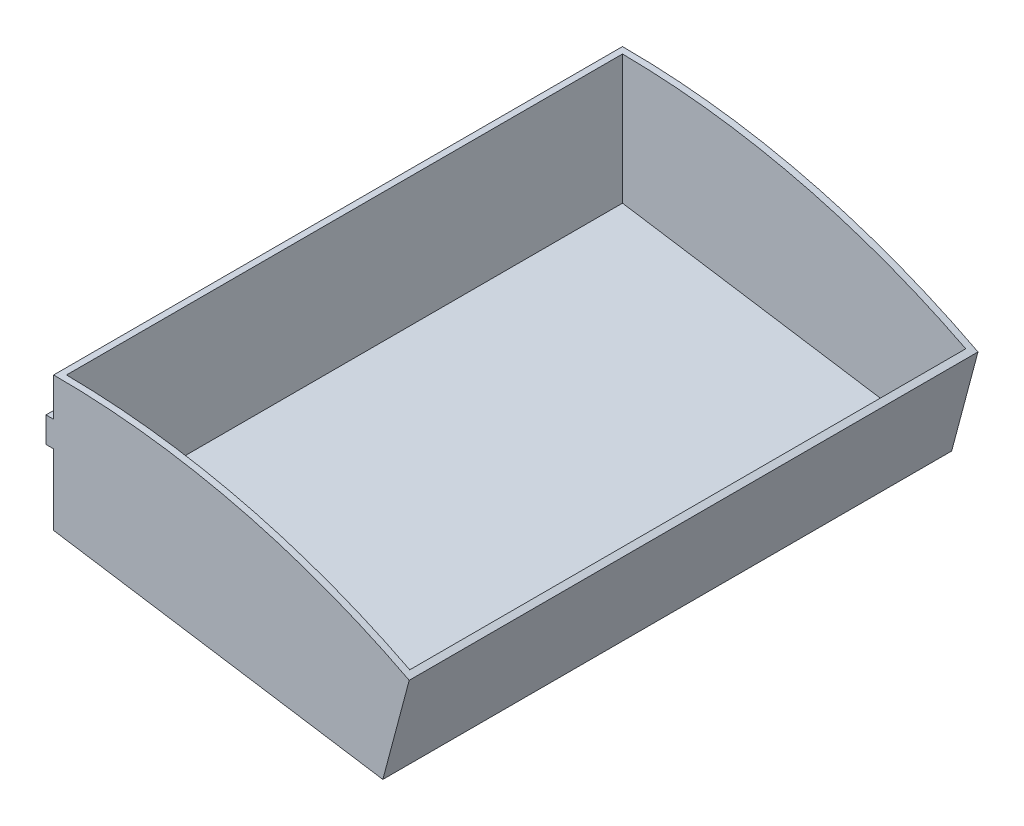
ISO-10303-21;
HEADER;
FILE_DESCRIPTION(('STEP AP214'),'2;1');
FILE_NAME('part.step','',(''),(''),'','','');
FILE_SCHEMA(('AUTOMOTIVE_DESIGN { 1 0 10303 214 1 1 1 1 }'));
ENDSEC;
DATA;
#1=APPLICATION_CONTEXT('core data for automotive mechanical design processes');
#2=APPLICATION_PROTOCOL_DEFINITION('international standard','automotive_design',2000,#1);
#3=PRODUCT_CONTEXT('',#1,'mechanical');
#4=PRODUCT('Part','Part','',(#3));
#5=PRODUCT_RELATED_PRODUCT_CATEGORY('part','',(#4));
#6=PRODUCT_DEFINITION_FORMATION('','',#4);
#7=PRODUCT_DEFINITION_CONTEXT('part definition',#1,'design');
#8=PRODUCT_DEFINITION('design','',#6,#7);
#9=PRODUCT_DEFINITION_SHAPE('','',#8);
#10=(LENGTH_UNIT() NAMED_UNIT(*) SI_UNIT(.MILLI.,.METRE.));
#11=(NAMED_UNIT(*) PLANE_ANGLE_UNIT() SI_UNIT($,.RADIAN.));
#12=(NAMED_UNIT(*) SI_UNIT($,.STERADIAN.) SOLID_ANGLE_UNIT());
#13=UNCERTAINTY_MEASURE_WITH_UNIT(LENGTH_MEASURE(1.E-05),#10,'distance_accuracy_value','');
#14=(GEOMETRIC_REPRESENTATION_CONTEXT(3) GLOBAL_UNCERTAINTY_ASSIGNED_CONTEXT((#13)) GLOBAL_UNIT_ASSIGNED_CONTEXT((#10,
#11,#12)) REPRESENTATION_CONTEXT('',''));
#15=CARTESIAN_POINT('',(0.,0.,0.));
#16=DIRECTION('',(0.,0.,1.));
#17=DIRECTION('',(1.,0.,0.));
#18=AXIS2_PLACEMENT_3D('',#15,#16,#17);
#19=CARTESIAN_POINT('',(0.,0.,563.88));
#20=DIRECTION('',(1.,0.,0.));
#21=DIRECTION('',(0.,0.,-1.));
#22=AXIS2_PLACEMENT_3D('',#19,#20,#21);
#23=PLANE('',#22);
#24=DIRECTION('',(0.,0.,-1.));
#25=VECTOR('',#24,1.);
#26=CARTESIAN_POINT('',(0.,95.472018750518,0.));
#27=LINE('',#26,#25);
#28=CARTESIAN_POINT('',(0.,95.472018750518,563.88));
#29=VERTEX_POINT('',#28);
#30=CARTESIAN_POINT('',(0.,95.472018750518,0.));
#31=VERTEX_POINT('',#30);
#32=EDGE_CURVE('E49',#29,#31,#27,.T.);
#33=ORIENTED_EDGE('',*,*,#32,.F.);
#34=DIRECTION('',(0.,-1.,0.));
#35=VECTOR('',#34,1.);
#36=CARTESIAN_POINT('',(0.,0.,563.88));
#37=LINE('',#36,#35);
#38=CARTESIAN_POINT('',(0.,133.572018750518,563.88));
#39=VERTEX_POINT('',#38);
#40=EDGE_CURVE('E194',#39,#29,#37,.T.);
#41=ORIENTED_EDGE('',*,*,#40,.F.);
#42=DIRECTION('',(0.,0.,-1.));
#43=VECTOR('',#42,1.);
#44=CARTESIAN_POINT('',(0.,133.572018750518,563.88));
#45=LINE('',#44,#43);
#46=CARTESIAN_POINT('',(0.,133.572018750518,0.));
#47=VERTEX_POINT('',#46);
#48=EDGE_CURVE('E206',#39,#47,#45,.T.);
#49=ORIENTED_EDGE('',*,*,#48,.T.);
#50=DIRECTION('',(0.,-1.,0.));
#51=VECTOR('',#50,1.);
#52=CARTESIAN_POINT('',(0.,0.,0.));
#53=LINE('',#52,#51);
#54=EDGE_CURVE('E189',#47,#31,#53,.T.);
#55=ORIENTED_EDGE('',*,*,#54,.T.);
#56=EDGE_LOOP('',(#33,#41,#49,#55));
#57=FACE_BOUND('',#56,.T.);
#58=ADVANCED_FACE('F34',(#57),#23,.F.);
#59=DIRECTION('',(0.,0.,1.));
#60=VECTOR('',#59,1.);
#61=CARTESIAN_POINT('',(0.,70.072018750518,0.));
#62=LINE('',#61,#60);
#63=CARTESIAN_POINT('',(0.,70.072018750518,0.));
#64=VERTEX_POINT('',#63);
#65=CARTESIAN_POINT('',(0.,70.072018750518,563.88));
#66=VERTEX_POINT('',#65);
#67=EDGE_CURVE('E57',#64,#66,#62,.T.);
#68=ORIENTED_EDGE('',*,*,#67,.F.);
#69=CARTESIAN_POINT('',(0.,0.,0.));
#70=VERTEX_POINT('',#69);
#71=EDGE_CURVE('E146',#64,#70,#53,.T.);
#72=ORIENTED_EDGE('',*,*,#71,.T.);
#73=DIRECTION('',(0.,0.,-1.));
#74=VECTOR('',#73,1.);
#75=CARTESIAN_POINT('',(0.,0.,563.88));
#76=LINE('',#75,#74);
#77=CARTESIAN_POINT('',(0.,0.,563.88));
#78=VERTEX_POINT('',#77);
#79=EDGE_CURVE('E196',#78,#70,#76,.T.);
#80=ORIENTED_EDGE('',*,*,#79,.F.);
#81=EDGE_CURVE('E193',#66,#78,#37,.T.);
#82=ORIENTED_EDGE('',*,*,#81,.F.);
#83=EDGE_LOOP('',(#68,#72,#80,#82));
#84=FACE_BOUND('',#83,.T.);
#85=ADVANCED_FACE('F235',(#84),#23,.F.);
#86=CARTESIAN_POINT('',(0.,-631.814252311311,563.88));
#87=DIRECTION('',(0.,0.,-1.));
#88=DIRECTION('',(-1.,0.,0.));
#89=AXIS2_PLACEMENT_3D('',#86,#87,#88);
#90=CYLINDRICAL_SURFACE('',#89,765.386271061829);
#91=CARTESIAN_POINT('',(0.,-631.814252311311,0.));
#92=DIRECTION('',(0.,0.,1.));
#93=DIRECTION('',(-1.,0.,0.));
#94=AXIS2_PLACEMENT_3D('',#91,#92,#93);
#95=CIRCLE('',#94,765.386271061829);
#96=CARTESIAN_POINT('',(352.425,47.606650594194,0.));
#97=VERTEX_POINT('',#96);
#98=EDGE_CURVE('E201',#97,#47,#95,.T.);
#99=ORIENTED_EDGE('',*,*,#98,.T.);
#100=ORIENTED_EDGE('',*,*,#48,.F.);
#101=CARTESIAN_POINT('',(0.,-631.814252311311,563.88));
#102=DIRECTION('',(0.,0.,1.));
#103=DIRECTION('',(-1.,0.,0.));
#104=AXIS2_PLACEMENT_3D('',#101,#102,#103);
#105=CIRCLE('',#104,765.386271061829);
#106=CARTESIAN_POINT('',(352.425,47.606650594194,563.88));
#107=VERTEX_POINT('',#106);
#108=EDGE_CURVE('E191',#107,#39,#105,.T.);
#109=ORIENTED_EDGE('',*,*,#108,.F.);
#110=DIRECTION('',(0.,0.,-1.));
#111=VECTOR('',#110,1.);
#112=CARTESIAN_POINT('',(352.425,47.606650594194,563.88));
#113=LINE('',#112,#111);
#114=EDGE_CURVE('E42',#107,#97,#113,.T.);
#115=ORIENTED_EDGE('',*,*,#114,.T.);
#116=EDGE_LOOP('',(#99,#100,#109,#115));
#117=FACE_BOUND('',#116,.T.);
#118=CARTESIAN_POINT('',(0.,-631.814252311311,6.34999999999997));
#119=DIRECTION('',(0.,0.,-1.));
#120=DIRECTION('',(-1.,0.,0.));
#121=AXIS2_PLACEMENT_3D('',#118,#119,#120);
#122=CIRCLE('',#121,765.386271061829);
#123=CARTESIAN_POINT('',(346.64367750762,50.5744234255633,6.35));
#124=VERTEX_POINT('',#123);
#125=CARTESIAN_POINT('',(6.35,133.545677022549,6.35));
#126=VERTEX_POINT('',#125);
#127=EDGE_CURVE('E172',#124,#126,#122,.F.);
#128=ORIENTED_EDGE('',*,*,#127,.F.);
#129=DIRECTION('',(0.,0.,-1.));
#130=VECTOR('',#129,1.);
#131=CARTESIAN_POINT('',(346.64367750762,50.5744234255633,557.53));
#132=LINE('',#131,#130);
#133=CARTESIAN_POINT('',(346.64367750762,50.5744234255633,557.53));
#134=VERTEX_POINT('',#133);
#135=EDGE_CURVE('E160',#134,#124,#132,.T.);
#136=ORIENTED_EDGE('',*,*,#135,.F.);
#137=CARTESIAN_POINT('',(0.,-631.814252311311,557.53));
#138=DIRECTION('',(0.,0.,-1.));
#139=DIRECTION('',(-1.,0.,0.));
#140=AXIS2_PLACEMENT_3D('',#137,#138,#139);
#141=CIRCLE('',#140,765.386271061829);
#142=CARTESIAN_POINT('',(6.35,133.545677022549,557.53));
#143=VERTEX_POINT('',#142);
#144=EDGE_CURVE('E175',#134,#143,#141,.F.);
#145=ORIENTED_EDGE('',*,*,#144,.T.);
#146=DIRECTION('',(0.,0.,-1.));
#147=VECTOR('',#146,1.);
#148=CARTESIAN_POINT('',(6.35,133.545677022549,557.53));
#149=LINE('',#148,#147);
#150=EDGE_CURVE('E169',#143,#126,#149,.T.);
#151=ORIENTED_EDGE('',*,*,#150,.T.);
#152=EDGE_LOOP('',(#128,#136,#145,#151));
#153=FACE_BOUND('',#152,.T.);
#154=ADVANCED_FACE('F213',(#117,#153),#90,.T.);
#155=CARTESIAN_POINT('',(326.303398408179,-50.577981249482,563.88));
#156=DIRECTION('',(0.15317377725464,0.988199268347,0.));
#157=DIRECTION('',(-0.988199268347,0.15317377725464,0.));
#158=AXIS2_PLACEMENT_3D('',#155,#156,#157);
#159=PLANE('',#158);
#160=DIRECTION('',(0.988199268347,-0.15317377725464,0.));
#161=VECTOR('',#160,1.);
#162=CARTESIAN_POINT('',(326.303398408179,-50.577981249482,0.));
#163=LINE('',#162,#161);
#164=CARTESIAN_POINT('',(326.303398408179,-50.577981249482,0.));
#165=VERTEX_POINT('',#164);
#166=EDGE_CURVE('E159',#70,#165,#163,.T.);
#167=ORIENTED_EDGE('',*,*,#166,.T.);
#168=DIRECTION('',(0.,0.,-1.));
#169=VECTOR('',#168,1.);
#170=CARTESIAN_POINT('',(326.303398408179,-50.577981249482,563.88));
#171=LINE('',#170,#169);
#172=CARTESIAN_POINT('',(326.303398408179,-50.577981249482,563.88));
#173=VERTEX_POINT('',#172);
#174=EDGE_CURVE('E11',#173,#165,#171,.T.);
#175=ORIENTED_EDGE('',*,*,#174,.F.);
#176=DIRECTION('',(0.988199268347,-0.15317377725464,0.));
#177=VECTOR('',#176,1.);
#178=CARTESIAN_POINT('',(326.303398408179,-50.577981249482,563.88));
#179=LINE('',#178,#177);
#180=EDGE_CURVE('E185',#78,#173,#179,.T.);
#181=ORIENTED_EDGE('',*,*,#180,.F.);
#182=ORIENTED_EDGE('',*,*,#79,.T.);
#183=EDGE_LOOP('',(#167,#175,#181,#182));
#184=FACE_BOUND('',#183,.T.);
#185=ADVANCED_FACE('F36',(#184),#159,.F.);
#186=CARTESIAN_POINT('',(352.425,47.6066505941939,563.88));
#187=DIRECTION('',(-0.966384171689724,0.257102377872251,0.));
#188=DIRECTION('',(-0.257102377872251,-0.966384171689724,0.));
#189=AXIS2_PLACEMENT_3D('',#186,#187,#188);
#190=PLANE('',#189);
#191=DIRECTION('',(0.257102377872251,0.966384171689724,0.));
#192=VECTOR('',#191,1.);
#193=CARTESIAN_POINT('',(352.425,47.6066505941939,0.));
#194=LINE('',#193,#192);
#195=EDGE_CURVE('E199',#165,#97,#194,.T.);
#196=ORIENTED_EDGE('',*,*,#195,.T.);
#197=ORIENTED_EDGE('',*,*,#114,.F.);
#198=DIRECTION('',(0.257102377872251,0.966384171689724,0.));
#199=VECTOR('',#198,1.);
#200=CARTESIAN_POINT('',(352.425,47.6066505941939,563.88));
#201=LINE('',#200,#199);
#202=EDGE_CURVE('E188',#173,#107,#201,.T.);
#203=ORIENTED_EDGE('',*,*,#202,.F.);
#204=ORIENTED_EDGE('',*,*,#174,.T.);
#205=EDGE_LOOP('',(#196,#197,#203,#204));
#206=FACE_BOUND('',#205,.T.);
#207=ADVANCED_FACE('F232',(#206),#190,.F.);
#208=CARTESIAN_POINT('',(0.,-631.814252311311,563.88));
#209=DIRECTION('',(0.,0.,-1.));
#210=DIRECTION('',(-1.,0.,0.));
#211=AXIS2_PLACEMENT_3D('',#208,#209,#210);
#212=PLANE('',#211);
#213=ORIENTED_EDGE('',*,*,#180,.T.);
#214=ORIENTED_EDGE('',*,*,#202,.T.);
#215=ORIENTED_EDGE('',*,*,#108,.T.);
#216=ORIENTED_EDGE('',*,*,#40,.T.);
#217=DIRECTION('',(1.,0.,0.));
#218=VECTOR('',#217,1.);
#219=CARTESIAN_POINT('',(-7.62,95.472018750518,563.88));
#220=LINE('',#219,#218);
#221=CARTESIAN_POINT('',(-7.62,95.472018750518,563.88));
#222=VERTEX_POINT('',#221);
#223=EDGE_CURVE('E152',#222,#29,#220,.T.);
#224=ORIENTED_EDGE('',*,*,#223,.F.);
#225=DIRECTION('',(0.,1.,0.));
#226=VECTOR('',#225,1.);
#227=CARTESIAN_POINT('',(-7.62,95.472018750518,563.88));
#228=LINE('',#227,#226);
#229=CARTESIAN_POINT('',(-7.62,70.072018750518,563.88));
#230=VERTEX_POINT('',#229);
#231=EDGE_CURVE('E133',#230,#222,#228,.T.);
#232=ORIENTED_EDGE('',*,*,#231,.F.);
#233=DIRECTION('',(1.,0.,0.));
#234=VECTOR('',#233,1.);
#235=CARTESIAN_POINT('',(-7.62,70.072018750518,563.88));
#236=LINE('',#235,#234);
#237=EDGE_CURVE('E130',#230,#66,#236,.T.);
#238=ORIENTED_EDGE('',*,*,#237,.T.);
#239=ORIENTED_EDGE('',*,*,#81,.T.);
#240=EDGE_LOOP('',(#213,#214,#215,#216,#224,#232,#238,#239));
#241=FACE_BOUND('',#240,.T.);
#242=ADVANCED_FACE('F229',(#241),#212,.F.);
#243=CARTESIAN_POINT('',(0.,-631.814252311311,0.));
#244=DIRECTION('',(0.,0.,-1.));
#245=DIRECTION('',(-1.,0.,0.));
#246=AXIS2_PLACEMENT_3D('',#243,#244,#245);
#247=PLANE('',#246);
#248=ORIENTED_EDGE('',*,*,#166,.F.);
#249=ORIENTED_EDGE('',*,*,#71,.F.);
#250=DIRECTION('',(1.,0.,0.));
#251=VECTOR('',#250,1.);
#252=CARTESIAN_POINT('',(-7.62,70.072018750518,0.));
#253=LINE('',#252,#251);
#254=CARTESIAN_POINT('',(-7.62,70.072018750518,0.));
#255=VERTEX_POINT('',#254);
#256=EDGE_CURVE('E128',#255,#64,#253,.T.);
#257=ORIENTED_EDGE('',*,*,#256,.F.);
#258=DIRECTION('',(0.,-1.,0.));
#259=VECTOR('',#258,1.);
#260=CARTESIAN_POINT('',(-7.62,95.472018750518,0.));
#261=LINE('',#260,#259);
#262=CARTESIAN_POINT('',(-7.62,95.472018750518,0.));
#263=VERTEX_POINT('',#262);
#264=EDGE_CURVE('E134',#263,#255,#261,.T.);
#265=ORIENTED_EDGE('',*,*,#264,.F.);
#266=DIRECTION('',(1.,0.,0.));
#267=VECTOR('',#266,1.);
#268=CARTESIAN_POINT('',(-7.62,95.472018750518,0.));
#269=LINE('',#268,#267);
#270=EDGE_CURVE('E218',#263,#31,#269,.T.);
#271=ORIENTED_EDGE('',*,*,#270,.T.);
#272=ORIENTED_EDGE('',*,*,#54,.F.);
#273=ORIENTED_EDGE('',*,*,#98,.F.);
#274=ORIENTED_EDGE('',*,*,#195,.F.);
#275=EDGE_LOOP('',(#248,#249,#257,#265,#271,#272,#273,#274));
#276=FACE_BOUND('',#275,.T.);
#277=ADVANCED_FACE('F145',(#276),#247,.T.);
#278=CARTESIAN_POINT('',(327.276051893746,-44.3029158954786,563.88));
#279=DIRECTION('',(0.15317377725464,0.988199268347,0.));
#280=DIRECTION('',(-0.988199268347,0.15317377725464,0.));
#281=AXIS2_PLACEMENT_3D('',#278,#279,#280);
#282=PLANE('',#281);
#283=DIRECTION('',(0.988199268347,-0.15317377725464,0.));
#284=VECTOR('',#283,1.);
#285=CARTESIAN_POINT('',(96.6079851964612,-8.54869081175624,6.35));
#286=LINE('',#285,#284);
#287=CARTESIAN_POINT('',(6.35,5.44156091455921,6.35));
#288=VERTEX_POINT('',#287);
#289=CARTESIAN_POINT('',(321.634608056786,-43.4284755985104,6.35));
#290=VERTEX_POINT('',#289);
#291=EDGE_CURVE('E147',#288,#290,#286,.T.);
#292=ORIENTED_EDGE('',*,*,#291,.F.);
#293=DIRECTION('',(0.,0.,-1.));
#294=VECTOR('',#293,1.);
#295=CARTESIAN_POINT('',(6.35000000000002,5.4415609145592,563.88));
#296=LINE('',#295,#294);
#297=CARTESIAN_POINT('',(6.35,5.44156091455921,557.53));
#298=VERTEX_POINT('',#297);
#299=EDGE_CURVE('E166',#298,#288,#296,.T.);
#300=ORIENTED_EDGE('',*,*,#299,.F.);
#301=DIRECTION('',(0.988199268347,-0.15317377725464,0.));
#302=VECTOR('',#301,1.);
#303=CARTESIAN_POINT('',(96.6079851964612,-8.54869081175624,557.53));
#304=LINE('',#303,#302);
#305=CARTESIAN_POINT('',(321.634608056786,-43.4284755985104,557.53));
#306=VERTEX_POINT('',#305);
#307=EDGE_CURVE('E161',#298,#306,#304,.T.);
#308=ORIENTED_EDGE('',*,*,#307,.T.);
#309=DIRECTION('',(0.,0.,-1.));
#310=VECTOR('',#309,1.);
#311=CARTESIAN_POINT('',(321.634608056786,-43.4284755985104,563.88));
#312=LINE('',#311,#310);
#313=EDGE_CURVE('E156',#306,#290,#312,.T.);
#314=ORIENTED_EDGE('',*,*,#313,.T.);
#315=EDGE_LOOP('',(#292,#300,#308,#314));
#316=FACE_BOUND('',#315,.T.);
#317=ADVANCED_FACE('F265',(#316),#282,.T.);
#318=CARTESIAN_POINT('',(346.28846050977,49.2392506936827,563.88));
#319=DIRECTION('',(-0.966384171689724,0.257102377872251,0.));
#320=DIRECTION('',(-0.257102377872251,-0.966384171689724,0.));
#321=AXIS2_PLACEMENT_3D('',#318,#319,#320);
#322=PLANE('',#321);
#323=DIRECTION('',(0.257102377872251,0.966384171689724,0.));
#324=VECTOR('',#323,1.);
#325=CARTESIAN_POINT('',(154.18390030884,-672.834219898019,6.35));
#326=LINE('',#325,#324);
#327=EDGE_CURVE('E150',#290,#124,#326,.T.);
#328=ORIENTED_EDGE('',*,*,#327,.F.);
#329=ORIENTED_EDGE('',*,*,#313,.F.);
#330=DIRECTION('',(0.257102377872251,0.966384171689724,0.));
#331=VECTOR('',#330,1.);
#332=CARTESIAN_POINT('',(154.18390030884,-672.834219898019,557.53));
#333=LINE('',#332,#331);
#334=EDGE_CURVE('E164',#306,#134,#333,.T.);
#335=ORIENTED_EDGE('',*,*,#334,.T.);
#336=ORIENTED_EDGE('',*,*,#135,.T.);
#337=EDGE_LOOP('',(#328,#329,#335,#336));
#338=FACE_BOUND('',#337,.T.);
#339=ADVANCED_FACE('F269',(#338),#322,.T.);
#340=CARTESIAN_POINT('',(6.35,0.,563.88));
#341=DIRECTION('',(1.,0.,0.));
#342=DIRECTION('',(0.,0.,-1.));
#343=AXIS2_PLACEMENT_3D('',#340,#341,#342);
#344=PLANE('',#343);
#345=DIRECTION('',(0.,-1.,0.));
#346=VECTOR('',#345,1.);
#347=CARTESIAN_POINT('',(6.35,-631.814252311311,6.35));
#348=LINE('',#347,#346);
#349=EDGE_CURVE('E165',#126,#288,#348,.T.);
#350=ORIENTED_EDGE('',*,*,#349,.F.);
#351=ORIENTED_EDGE('',*,*,#150,.F.);
#352=DIRECTION('',(0.,-1.,0.));
#353=VECTOR('',#352,1.);
#354=CARTESIAN_POINT('',(6.35,-631.814252311311,557.53));
#355=LINE('',#354,#353);
#356=EDGE_CURVE('E170',#143,#298,#355,.T.);
#357=ORIENTED_EDGE('',*,*,#356,.T.);
#358=ORIENTED_EDGE('',*,*,#299,.T.);
#359=EDGE_LOOP('',(#350,#351,#357,#358));
#360=FACE_BOUND('',#359,.T.);
#361=ADVANCED_FACE('F280',(#360),#344,.T.);
#362=CARTESIAN_POINT('',(0.,-631.814252311311,557.53));
#363=DIRECTION('',(0.,0.,-1.));
#364=DIRECTION('',(-1.,0.,0.));
#365=AXIS2_PLACEMENT_3D('',#362,#363,#364);
#366=PLANE('',#365);
#367=ORIENTED_EDGE('',*,*,#307,.F.);
#368=ORIENTED_EDGE('',*,*,#356,.F.);
#369=ORIENTED_EDGE('',*,*,#144,.F.);
#370=ORIENTED_EDGE('',*,*,#334,.F.);
#371=EDGE_LOOP('',(#367,#368,#369,#370));
#372=FACE_BOUND('',#371,.T.);
#373=ADVANCED_FACE('F290',(#372),#366,.T.);
#374=CARTESIAN_POINT('',(0.,-631.814252311311,6.35));
#375=DIRECTION('',(0.,0.,-1.));
#376=DIRECTION('',(-1.,0.,0.));
#377=AXIS2_PLACEMENT_3D('',#374,#375,#376);
#378=PLANE('',#377);
#379=ORIENTED_EDGE('',*,*,#291,.T.);
#380=ORIENTED_EDGE('',*,*,#327,.T.);
#381=ORIENTED_EDGE('',*,*,#127,.T.);
#382=ORIENTED_EDGE('',*,*,#349,.T.);
#383=EDGE_LOOP('',(#379,#380,#381,#382));
#384=FACE_BOUND('',#383,.T.);
#385=ADVANCED_FACE('F300',(#384),#378,.F.);
#386=CARTESIAN_POINT('',(-7.62,70.072018750518,0.));
#387=DIRECTION('',(0.,1.,0.));
#388=DIRECTION('',(0.,0.,1.));
#389=AXIS2_PLACEMENT_3D('',#386,#387,#388);
#390=PLANE('',#389);
#391=ORIENTED_EDGE('',*,*,#67,.T.);
#392=ORIENTED_EDGE('',*,*,#237,.F.);
#393=DIRECTION('',(0.,0.,1.));
#394=VECTOR('',#393,1.);
#395=CARTESIAN_POINT('',(-7.62,70.072018750518,0.));
#396=LINE('',#395,#394);
#397=EDGE_CURVE('E124',#255,#230,#396,.T.);
#398=ORIENTED_EDGE('',*,*,#397,.F.);
#399=ORIENTED_EDGE('',*,*,#256,.T.);
#400=EDGE_LOOP('',(#391,#392,#398,#399));
#401=FACE_BOUND('',#400,.T.);
#402=ADVANCED_FACE('F126',(#401),#390,.F.);
#403=CARTESIAN_POINT('',(-7.62,95.472018750518,0.));
#404=DIRECTION('',(0.,-1.,0.));
#405=DIRECTION('',(0.,0.,-1.));
#406=AXIS2_PLACEMENT_3D('',#403,#404,#405);
#407=PLANE('',#406);
#408=ORIENTED_EDGE('',*,*,#32,.T.);
#409=ORIENTED_EDGE('',*,*,#270,.F.);
#410=DIRECTION('',(0.,0.,-1.));
#411=VECTOR('',#410,1.);
#412=CARTESIAN_POINT('',(-7.62,95.472018750518,0.));
#413=LINE('',#412,#411);
#414=EDGE_CURVE('E139',#222,#263,#413,.T.);
#415=ORIENTED_EDGE('',*,*,#414,.F.);
#416=ORIENTED_EDGE('',*,*,#223,.T.);
#417=EDGE_LOOP('',(#408,#409,#415,#416));
#418=FACE_BOUND('',#417,.T.);
#419=ADVANCED_FACE('F221',(#418),#407,.F.);
#420=CARTESIAN_POINT('',(-7.62,0.,0.));
#421=DIRECTION('',(-1.,0.,0.));
#422=DIRECTION('',(0.,0.,1.));
#423=AXIS2_PLACEMENT_3D('',#420,#421,#422);
#424=PLANE('',#423);
#425=ORIENTED_EDGE('',*,*,#264,.T.);
#426=ORIENTED_EDGE('',*,*,#397,.T.);
#427=ORIENTED_EDGE('',*,*,#231,.T.);
#428=ORIENTED_EDGE('',*,*,#414,.T.);
#429=EDGE_LOOP('',(#425,#426,#427,#428));
#430=FACE_BOUND('',#429,.T.);
#431=ADVANCED_FACE('F137',(#430),#424,.T.);
#432=CLOSED_SHELL('',(#58,#85,#154,#185,#207,#242,#277,#317,#339,#361,#373,#385,#402,#419,#431));
#433=MANIFOLD_SOLID_BREP('B2',#432);
#434=ADVANCED_BREP_SHAPE_REPRESENTATION('',(#18,#433),#14);
#435=SHAPE_DEFINITION_REPRESENTATION(#9,#434);
ENDSEC;
END-ISO-10303-21;
